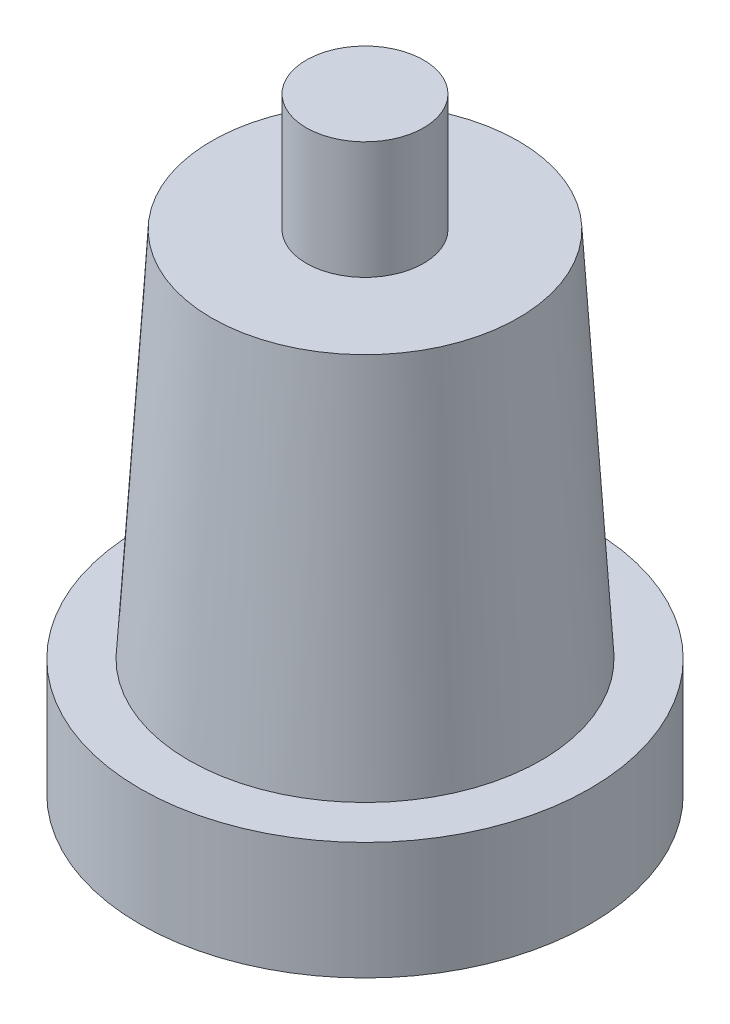
ISO-10303-21;
HEADER;
FILE_DESCRIPTION(('STEP AP214'),'2;1');
FILE_NAME('part.step','',(''),(''),'','','');
FILE_SCHEMA(('AUTOMOTIVE_DESIGN { 1 0 10303 214 1 1 1 1 }'));
ENDSEC;
DATA;
#1=APPLICATION_CONTEXT('core data for automotive mechanical design processes');
#2=APPLICATION_PROTOCOL_DEFINITION('international standard','automotive_design',2000,#1);
#3=PRODUCT_CONTEXT('',#1,'mechanical');
#4=PRODUCT('Part','Part','',(#3));
#5=PRODUCT_RELATED_PRODUCT_CATEGORY('part','',(#4));
#6=PRODUCT_DEFINITION_FORMATION('','',#4);
#7=PRODUCT_DEFINITION_CONTEXT('part definition',#1,'design');
#8=PRODUCT_DEFINITION('design','',#6,#7);
#9=PRODUCT_DEFINITION_SHAPE('','',#8);
#10=(LENGTH_UNIT() NAMED_UNIT(*) SI_UNIT(.MILLI.,.METRE.));
#11=(NAMED_UNIT(*) PLANE_ANGLE_UNIT() SI_UNIT($,.RADIAN.));
#12=(NAMED_UNIT(*) SI_UNIT($,.STERADIAN.) SOLID_ANGLE_UNIT());
#13=UNCERTAINTY_MEASURE_WITH_UNIT(LENGTH_MEASURE(1.E-05),#10,'distance_accuracy_value','');
#14=(GEOMETRIC_REPRESENTATION_CONTEXT(3) GLOBAL_UNCERTAINTY_ASSIGNED_CONTEXT((#13)) GLOBAL_UNIT_ASSIGNED_CONTEXT((#10,
#11,#12)) REPRESENTATION_CONTEXT('',''));
#15=CARTESIAN_POINT('',(0.,0.,0.));
#16=DIRECTION('',(0.,0.,1.));
#17=DIRECTION('',(1.,0.,0.));
#18=AXIS2_PLACEMENT_3D('',#15,#16,#17);
#19=CARTESIAN_POINT('',(0.,250.,0.));
#20=DIRECTION('',(0.,1.,0.));
#21=DIRECTION('',(0.,0.,1.));
#22=AXIS2_PLACEMENT_3D('',#19,#20,#21);
#23=PLANE('',#22);
#24=CARTESIAN_POINT('',(0.,250.,0.));
#25=DIRECTION('',(0.,1.,0.));
#26=DIRECTION('',(0.,0.,1.));
#27=AXIS2_PLACEMENT_3D('',#24,#25,#26);
#28=CIRCLE('',#27,78.379102171408);
#29=CARTESIAN_POINT('',(0.,250.,78.379102171408));
#30=VERTEX_POINT('',#29);
#31=EDGE_CURVE('E42',#30,#30,#28,.T.);
#32=ORIENTED_EDGE('',*,*,#31,.T.);
#33=EDGE_LOOP('',(#32));
#34=FACE_BOUND('',#33,.T.);
#35=CARTESIAN_POINT('',(0.,250.,0.));
#36=DIRECTION('',(0.,1.,0.));
#37=DIRECTION('',(0.,0.,1.));
#38=AXIS2_PLACEMENT_3D('',#35,#36,#37);
#39=CIRCLE('',#38,30.);
#40=CARTESIAN_POINT('',(0.,250.,30.));
#41=VERTEX_POINT('',#40);
#42=EDGE_CURVE('E50',#41,#41,#39,.T.);
#43=ORIENTED_EDGE('',*,*,#42,.F.);
#44=EDGE_LOOP('',(#43));
#45=FACE_BOUND('',#44,.T.);
#46=ADVANCED_FACE('F31',(#34,#45),#23,.T.);
#47=CARTESIAN_POINT('',(0.,60.,0.));
#48=DIRECTION('',(0.,1.,0.));
#49=DIRECTION('',(0.,0.,1.));
#50=AXIS2_PLACEMENT_3D('',#47,#48,#49);
#51=PLANE('',#50);
#52=CARTESIAN_POINT('',(0.,60.,0.));
#53=DIRECTION('',(0.,1.,0.));
#54=DIRECTION('',(0.,0.,1.));
#55=AXIS2_PLACEMENT_3D('',#52,#53,#54);
#56=CIRCLE('',#55,115.);
#57=CARTESIAN_POINT('',(0.,60.,115.));
#58=VERTEX_POINT('',#57);
#59=EDGE_CURVE('E10',#58,#58,#56,.T.);
#60=ORIENTED_EDGE('',*,*,#59,.T.);
#61=EDGE_LOOP('',(#60));
#62=FACE_BOUND('',#61,.T.);
#63=CARTESIAN_POINT('',(0.,60.,0.));
#64=DIRECTION('',(0.,1.,0.));
#65=DIRECTION('',(0.,0.,1.));
#66=AXIS2_PLACEMENT_3D('',#63,#64,#65);
#67=CIRCLE('',#66,90.);
#68=CARTESIAN_POINT('',(0.,60.,90.));
#69=VERTEX_POINT('',#68);
#70=EDGE_CURVE('E46',#69,#69,#67,.T.);
#71=ORIENTED_EDGE('',*,*,#70,.F.);
#72=EDGE_LOOP('',(#71));
#73=FACE_BOUND('',#72,.T.);
#74=ADVANCED_FACE('F66',(#62,#73),#51,.T.);
#75=CARTESIAN_POINT('',(0.,60.,0.));
#76=DIRECTION('',(0.,-1.,0.));
#77=DIRECTION('',(0.,0.,-1.));
#78=AXIS2_PLACEMENT_3D('',#75,#76,#77);
#79=CYLINDRICAL_SURFACE('',#78,115.);
#80=ORIENTED_EDGE('',*,*,#59,.F.);
#81=EDGE_LOOP('',(#80));
#82=FACE_BOUND('',#81,.T.);
#83=CARTESIAN_POINT('',(0.,0.,0.));
#84=DIRECTION('',(0.,1.,0.));
#85=DIRECTION('',(0.,0.,1.));
#86=AXIS2_PLACEMENT_3D('',#83,#84,#85);
#87=CIRCLE('',#86,115.);
#88=CARTESIAN_POINT('',(0.,0.,115.));
#89=VERTEX_POINT('',#88);
#90=EDGE_CURVE('E35',#89,#89,#87,.T.);
#91=ORIENTED_EDGE('',*,*,#90,.T.);
#92=EDGE_LOOP('',(#91));
#93=FACE_BOUND('',#92,.T.);
#94=ADVANCED_FACE('F33',(#82,#93),#79,.T.);
#95=CARTESIAN_POINT('',(0.,0.,0.));
#96=DIRECTION('',(0.,1.,0.));
#97=DIRECTION('',(0.,0.,1.));
#98=AXIS2_PLACEMENT_3D('',#95,#96,#97);
#99=PLANE('',#98);
#100=ORIENTED_EDGE('',*,*,#90,.F.);
#101=EDGE_LOOP('',(#100));
#102=FACE_BOUND('',#101,.T.);
#103=ADVANCED_FACE('F76',(#102),#99,.F.);
#104=CARTESIAN_POINT('',(0.,60.,0.));
#105=DIRECTION('',(0.,-1.,0.));
#106=DIRECTION('',(0.,0.,1.));
#107=AXIS2_PLACEMENT_3D('',#104,#105,#106);
#108=CONICAL_SURFACE('',#107,90.,0.0610865238198017);
#109=ORIENTED_EDGE('',*,*,#31,.F.);
#110=EDGE_LOOP('',(#109));
#111=FACE_BOUND('',#110,.T.);
#112=ORIENTED_EDGE('',*,*,#70,.T.);
#113=EDGE_LOOP('',(#112));
#114=FACE_BOUND('',#113,.T.);
#115=ADVANCED_FACE('F61',(#111,#114),#108,.T.);
#116=CARTESIAN_POINT('',(0.,310.,0.));
#117=DIRECTION('',(0.,-1.,0.));
#118=DIRECTION('',(0.,0.,-1.));
#119=AXIS2_PLACEMENT_3D('',#116,#117,#118);
#120=CYLINDRICAL_SURFACE('',#119,30.);
#121=CARTESIAN_POINT('',(0.,310.,0.));
#122=DIRECTION('',(0.,1.,0.));
#123=DIRECTION('',(0.,0.,1.));
#124=AXIS2_PLACEMENT_3D('',#121,#122,#123);
#125=CIRCLE('',#124,30.);
#126=CARTESIAN_POINT('',(0.,310.,30.));
#127=VERTEX_POINT('',#126);
#128=EDGE_CURVE('E49',#127,#127,#125,.T.);
#129=ORIENTED_EDGE('',*,*,#128,.F.);
#130=EDGE_LOOP('',(#129));
#131=FACE_BOUND('',#130,.T.);
#132=ORIENTED_EDGE('',*,*,#42,.T.);
#133=EDGE_LOOP('',(#132));
#134=FACE_BOUND('',#133,.T.);
#135=ADVANCED_FACE('F58',(#131,#134),#120,.T.);
#136=CARTESIAN_POINT('',(0.,310.,0.));
#137=DIRECTION('',(0.,1.,0.));
#138=DIRECTION('',(0.,0.,1.));
#139=AXIS2_PLACEMENT_3D('',#136,#137,#138);
#140=PLANE('',#139);
#141=ORIENTED_EDGE('',*,*,#128,.T.);
#142=EDGE_LOOP('',(#141));
#143=FACE_BOUND('',#142,.T.);
#144=ADVANCED_FACE('F56',(#143),#140,.T.);
#145=CLOSED_SHELL('',(#46,#74,#94,#103,#115,#135,#144));
#146=MANIFOLD_SOLID_BREP('B2',#145);
#147=ADVANCED_BREP_SHAPE_REPRESENTATION('',(#18,#146),#14);
#148=SHAPE_DEFINITION_REPRESENTATION(#9,#147);
ENDSEC;
END-ISO-10303-21;
